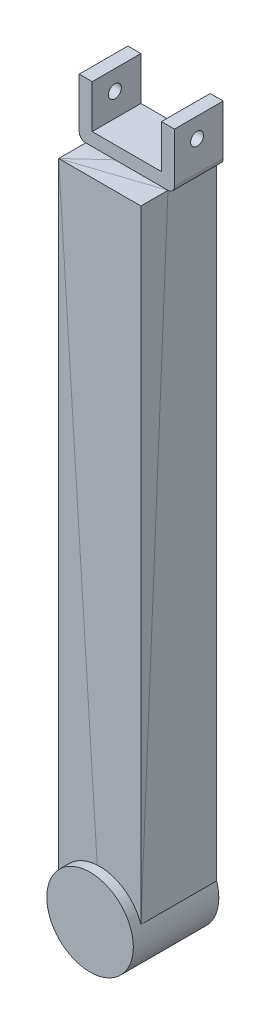
ISO-10303-21;
HEADER;
FILE_DESCRIPTION(('STEP AP214'),'2;1');
FILE_NAME('part.step','',(''),(''),'','','');
FILE_SCHEMA(('AUTOMOTIVE_DESIGN { 1 0 10303 214 1 1 1 1 }'));
ENDSEC;
DATA;
#1=APPLICATION_CONTEXT('core data for automotive mechanical design processes');
#2=APPLICATION_PROTOCOL_DEFINITION('international standard','automotive_design',2000,#1);
#3=PRODUCT_CONTEXT('',#1,'mechanical');
#4=PRODUCT('Part','Part','',(#3));
#5=PRODUCT_RELATED_PRODUCT_CATEGORY('part','',(#4));
#6=PRODUCT_DEFINITION_FORMATION('','',#4);
#7=PRODUCT_DEFINITION_CONTEXT('part definition',#1,'design');
#8=PRODUCT_DEFINITION('design','',#6,#7);
#9=PRODUCT_DEFINITION_SHAPE('','',#8);
#10=(LENGTH_UNIT() NAMED_UNIT(*) SI_UNIT(.MILLI.,.METRE.));
#11=(NAMED_UNIT(*) PLANE_ANGLE_UNIT() SI_UNIT($,.RADIAN.));
#12=(NAMED_UNIT(*) SI_UNIT($,.STERADIAN.) SOLID_ANGLE_UNIT());
#13=UNCERTAINTY_MEASURE_WITH_UNIT(LENGTH_MEASURE(1.E-05),#10,'distance_accuracy_value','');
#14=(GEOMETRIC_REPRESENTATION_CONTEXT(3) GLOBAL_UNCERTAINTY_ASSIGNED_CONTEXT((#13)) GLOBAL_UNIT_ASSIGNED_CONTEXT((#10,
#11,#12)) REPRESENTATION_CONTEXT('',''));
#15=CARTESIAN_POINT('',(0.,0.,0.));
#16=DIRECTION('',(0.,0.,1.));
#17=DIRECTION('',(1.,0.,0.));
#18=AXIS2_PLACEMENT_3D('',#15,#16,#17);
#19=CARTESIAN_POINT('',(-16.,6.,5.));
#20=DIRECTION('',(-1.,0.,0.));
#21=DIRECTION('',(0.,0.,1.));
#22=AXIS2_PLACEMENT_3D('',#19,#20,#21);
#23=PLANE('',#22);
#24=DIRECTION('',(0.,0.,-1.));
#25=VECTOR('',#24,1.);
#26=CARTESIAN_POINT('',(-16.,6.,5.));
#27=LINE('',#26,#25);
#28=CARTESIAN_POINT('',(-16.,6.,5.));
#29=VERTEX_POINT('',#28);
#30=CARTESIAN_POINT('',(-16.,6.,-17.5));
#31=VERTEX_POINT('',#30);
#32=EDGE_CURVE('E54',#29,#31,#27,.T.);
#33=ORIENTED_EDGE('',*,*,#32,.T.);
#34=DIRECTION('',(0.,1.,0.));
#35=VECTOR('',#34,1.);
#36=CARTESIAN_POINT('',(-16.,6.,-17.5));
#37=LINE('',#36,#35);
#38=CARTESIAN_POINT('',(-16.,26.,-17.5));
#39=VERTEX_POINT('',#38);
#40=EDGE_CURVE('E180',#31,#39,#37,.T.);
#41=ORIENTED_EDGE('',*,*,#40,.T.);
#42=DIRECTION('',(0.,0.,-1.));
#43=VECTOR('',#42,1.);
#44=CARTESIAN_POINT('',(-16.,26.,5.));
#45=LINE('',#44,#43);
#46=CARTESIAN_POINT('',(-16.,26.,5.));
#47=VERTEX_POINT('',#46);
#48=EDGE_CURVE('E237',#47,#39,#45,.T.);
#49=ORIENTED_EDGE('',*,*,#48,.F.);
#50=DIRECTION('',(0.,1.,0.));
#51=VECTOR('',#50,1.);
#52=CARTESIAN_POINT('',(-16.,6.,5.));
#53=LINE('',#52,#51);
#54=EDGE_CURVE('E204',#29,#47,#53,.T.);
#55=ORIENTED_EDGE('',*,*,#54,.F.);
#56=EDGE_LOOP('',(#33,#41,#49,#55));
#57=FACE_BOUND('',#56,.T.);
#58=CARTESIAN_POINT('',(-16.,16.8963252301986,-5.46063236981809));
#59=DIRECTION('',(-1.,0.,0.));
#60=DIRECTION('',(0.,0.,1.));
#61=AXIS2_PLACEMENT_3D('',#58,#59,#60);
#62=CIRCLE('',#61,3.);
#63=CARTESIAN_POINT('',(-16.,16.8963252301986,-2.46063236981809));
#64=VERTEX_POINT('',#63);
#65=EDGE_CURVE('E160',#64,#64,#62,.T.);
#66=ORIENTED_EDGE('',*,*,#65,.T.);
#67=EDGE_LOOP('',(#66));
#68=FACE_BOUND('',#67,.T.);
#69=ADVANCED_FACE('F46',(#57,#68),#23,.F.);
#70=CARTESIAN_POINT('',(-22.,3.00000000000002,5.));
#71=DIRECTION('',(1.,0.,0.));
#72=DIRECTION('',(0.,0.,-1.));
#73=AXIS2_PLACEMENT_3D('',#70,#71,#72);
#74=PLANE('',#73);
#75=DIRECTION('',(0.,0.,-1.));
#76=VECTOR('',#75,1.);
#77=CARTESIAN_POINT('',(-22.,26.,5.));
#78=LINE('',#77,#76);
#79=CARTESIAN_POINT('',(-22.,26.,5.));
#80=VERTEX_POINT('',#79);
#81=CARTESIAN_POINT('',(-22.,26.,-17.5));
#82=VERTEX_POINT('',#81);
#83=EDGE_CURVE('E235',#80,#82,#78,.T.);
#84=ORIENTED_EDGE('',*,*,#83,.T.);
#85=DIRECTION('',(0.,-1.,0.));
#86=VECTOR('',#85,1.);
#87=CARTESIAN_POINT('',(-22.,3.00000000000002,-17.5));
#88=LINE('',#87,#86);
#89=CARTESIAN_POINT('',(-22.,3.00000000000002,-17.5));
#90=VERTEX_POINT('',#89);
#91=EDGE_CURVE('E186',#82,#90,#88,.T.);
#92=ORIENTED_EDGE('',*,*,#91,.T.);
#93=DIRECTION('',(0.,0.,-1.));
#94=VECTOR('',#93,1.);
#95=CARTESIAN_POINT('',(-22.,3.00000000000002,5.));
#96=LINE('',#95,#94);
#97=CARTESIAN_POINT('',(-22.,3.00000000000002,5.));
#98=VERTEX_POINT('',#97);
#99=EDGE_CURVE('E233',#98,#90,#96,.T.);
#100=ORIENTED_EDGE('',*,*,#99,.F.);
#101=DIRECTION('',(0.,-1.,0.));
#102=VECTOR('',#101,1.);
#103=CARTESIAN_POINT('',(-22.,3.00000000000002,5.));
#104=LINE('',#103,#102);
#105=EDGE_CURVE('E208',#80,#98,#104,.T.);
#106=ORIENTED_EDGE('',*,*,#105,.F.);
#107=EDGE_LOOP('',(#84,#92,#100,#106));
#108=FACE_BOUND('',#107,.T.);
#109=CARTESIAN_POINT('',(-22.,16.8963252301986,-5.46063236981809));
#110=DIRECTION('',(-1.,0.,0.));
#111=DIRECTION('',(0.,0.,1.));
#112=AXIS2_PLACEMENT_3D('',#109,#110,#111);
#113=CIRCLE('',#112,3.);
#114=CARTESIAN_POINT('',(-22.,16.8963252301986,-2.46063236981809));
#115=VERTEX_POINT('',#114);
#116=EDGE_CURVE('E285',#115,#115,#113,.T.);
#117=ORIENTED_EDGE('',*,*,#116,.F.);
#118=EDGE_LOOP('',(#117));
#119=FACE_BOUND('',#118,.T.);
#120=ADVANCED_FACE('F305',(#108,#119),#74,.F.);
#121=CARTESIAN_POINT('',(-16.,6.,5.));
#122=DIRECTION('',(0.,-1.,0.));
#123=DIRECTION('',(0.,0.,-1.));
#124=AXIS2_PLACEMENT_3D('',#121,#122,#123);
#125=PLANE('',#124);
#126=DIRECTION('',(0.,0.,-1.));
#127=VECTOR('',#126,1.);
#128=CARTESIAN_POINT('',(16.,6.,5.));
#129=LINE('',#128,#127);
#130=CARTESIAN_POINT('',(16.,6.,5.));
#131=VERTEX_POINT('',#130);
#132=CARTESIAN_POINT('',(16.,6.,-17.5));
#133=VERTEX_POINT('',#132);
#134=EDGE_CURVE('E220',#131,#133,#129,.T.);
#135=ORIENTED_EDGE('',*,*,#134,.T.);
#136=DIRECTION('',(-1.,0.,0.));
#137=VECTOR('',#136,1.);
#138=CARTESIAN_POINT('',(-16.,6.,-17.5));
#139=LINE('',#138,#137);
#140=EDGE_CURVE('E177',#133,#31,#139,.T.);
#141=ORIENTED_EDGE('',*,*,#140,.T.);
#142=ORIENTED_EDGE('',*,*,#32,.F.);
#143=DIRECTION('',(-1.,0.,0.));
#144=VECTOR('',#143,1.);
#145=CARTESIAN_POINT('',(-16.,6.,5.));
#146=LINE('',#145,#144);
#147=EDGE_CURVE('E202',#131,#29,#146,.T.);
#148=ORIENTED_EDGE('',*,*,#147,.F.);
#149=EDGE_LOOP('',(#135,#141,#142,#148));
#150=FACE_BOUND('',#149,.T.);
#151=ADVANCED_FACE('F48',(#150),#125,.F.);
#152=CARTESIAN_POINT('',(-16.,26.,5.));
#153=DIRECTION('',(0.,-1.,0.));
#154=DIRECTION('',(0.,0.,-1.));
#155=AXIS2_PLACEMENT_3D('',#152,#153,#154);
#156=PLANE('',#155);
#157=ORIENTED_EDGE('',*,*,#48,.T.);
#158=DIRECTION('',(-1.,0.,0.));
#159=VECTOR('',#158,1.);
#160=CARTESIAN_POINT('',(-16.,26.,-17.5));
#161=LINE('',#160,#159);
#162=EDGE_CURVE('E183',#39,#82,#161,.T.);
#163=ORIENTED_EDGE('',*,*,#162,.T.);
#164=ORIENTED_EDGE('',*,*,#83,.F.);
#165=DIRECTION('',(-1.,0.,0.));
#166=VECTOR('',#165,1.);
#167=CARTESIAN_POINT('',(-16.,26.,5.));
#168=LINE('',#167,#166);
#169=EDGE_CURVE('E206',#47,#80,#168,.T.);
#170=ORIENTED_EDGE('',*,*,#169,.F.);
#171=EDGE_LOOP('',(#157,#163,#164,#170));
#172=FACE_BOUND('',#171,.T.);
#173=ADVANCED_FACE('F312',(#172),#156,.F.);
#174=CARTESIAN_POINT('',(-19.,3.,5.));
#175=DIRECTION('',(0.,0.,-1.));
#176=DIRECTION('',(-1.,0.,0.));
#177=AXIS2_PLACEMENT_3D('',#174,#175,#176);
#178=CYLINDRICAL_SURFACE('',#177,3.);
#179=ORIENTED_EDGE('',*,*,#99,.T.);
#180=CARTESIAN_POINT('',(-19.,3.,-17.5));
#181=DIRECTION('',(0.,0.,1.));
#182=DIRECTION('',(-1.,0.,0.));
#183=AXIS2_PLACEMENT_3D('',#180,#181,#182);
#184=CIRCLE('',#183,3.);
#185=CARTESIAN_POINT('',(-19.,0.,-17.5));
#186=VERTEX_POINT('',#185);
#187=EDGE_CURVE('E189',#90,#186,#184,.T.);
#188=ORIENTED_EDGE('',*,*,#187,.T.);
#189=DIRECTION('',(0.,0.,-1.));
#190=VECTOR('',#189,1.);
#191=CARTESIAN_POINT('',(-19.,0.,5.));
#192=LINE('',#191,#190);
#193=CARTESIAN_POINT('',(-19.,0.,5.));
#194=VERTEX_POINT('',#193);
#195=EDGE_CURVE('E230',#194,#186,#192,.T.);
#196=ORIENTED_EDGE('',*,*,#195,.F.);
#197=CARTESIAN_POINT('',(-19.,3.,5.));
#198=DIRECTION('',(0.,0.,1.));
#199=DIRECTION('',(-1.,0.,0.));
#200=AXIS2_PLACEMENT_3D('',#197,#198,#199);
#201=CIRCLE('',#200,3.);
#202=EDGE_CURVE('E210',#98,#194,#201,.T.);
#203=ORIENTED_EDGE('',*,*,#202,.F.);
#204=EDGE_LOOP('',(#179,#188,#196,#203));
#205=FACE_BOUND('',#204,.T.);
#206=ADVANCED_FACE('F314',(#205),#178,.T.);
#207=CARTESIAN_POINT('',(19.,3.,5.));
#208=DIRECTION('',(0.,0.,-1.));
#209=DIRECTION('',(-1.,0.,0.));
#210=AXIS2_PLACEMENT_3D('',#207,#208,#209);
#211=CYLINDRICAL_SURFACE('',#210,3.);
#212=DIRECTION('',(0.,0.,-1.));
#213=VECTOR('',#212,1.);
#214=CARTESIAN_POINT('',(19.,0.,5.));
#215=LINE('',#214,#213);
#216=CARTESIAN_POINT('',(19.,0.,5.));
#217=VERTEX_POINT('',#216);
#218=CARTESIAN_POINT('',(19.,0.,-17.5));
#219=VERTEX_POINT('',#218);
#220=EDGE_CURVE('E228',#217,#219,#215,.T.);
#221=ORIENTED_EDGE('',*,*,#220,.T.);
#222=CARTESIAN_POINT('',(19.,3.,-17.5));
#223=DIRECTION('',(0.,0.,1.));
#224=DIRECTION('',(1.,0.,0.));
#225=AXIS2_PLACEMENT_3D('',#222,#223,#224);
#226=CIRCLE('',#225,3.);
#227=CARTESIAN_POINT('',(22.,3.00000000000002,-17.5));
#228=VERTEX_POINT('',#227);
#229=EDGE_CURVE('E165',#219,#228,#226,.T.);
#230=ORIENTED_EDGE('',*,*,#229,.T.);
#231=DIRECTION('',(0.,0.,-1.));
#232=VECTOR('',#231,1.);
#233=CARTESIAN_POINT('',(22.,3.00000000000002,5.));
#234=LINE('',#233,#232);
#235=CARTESIAN_POINT('',(22.,3.00000000000002,5.));
#236=VERTEX_POINT('',#235);
#237=EDGE_CURVE('E226',#236,#228,#234,.T.);
#238=ORIENTED_EDGE('',*,*,#237,.F.);
#239=CARTESIAN_POINT('',(19.,3.,5.));
#240=DIRECTION('',(0.,0.,1.));
#241=DIRECTION('',(1.,0.,0.));
#242=AXIS2_PLACEMENT_3D('',#239,#240,#241);
#243=CIRCLE('',#242,3.);
#244=EDGE_CURVE('E214',#217,#236,#243,.T.);
#245=ORIENTED_EDGE('',*,*,#244,.F.);
#246=EDGE_LOOP('',(#221,#230,#238,#245));
#247=FACE_BOUND('',#246,.T.);
#248=ADVANCED_FACE('F260',(#247),#211,.T.);
#249=CARTESIAN_POINT('',(22.,3.00000000000002,5.));
#250=DIRECTION('',(-1.,0.,0.));
#251=DIRECTION('',(0.,0.,1.));
#252=AXIS2_PLACEMENT_3D('',#249,#250,#251);
#253=PLANE('',#252);
#254=CARTESIAN_POINT('',(22.,16.8963252301986,-5.46063236981809));
#255=DIRECTION('',(-1.,0.,0.));
#256=DIRECTION('',(0.,0.,1.));
#257=AXIS2_PLACEMENT_3D('',#254,#255,#256);
#258=CIRCLE('',#257,3.);
#259=CARTESIAN_POINT('',(22.,16.8963252301986,-2.46063236981809));
#260=VERTEX_POINT('',#259);
#261=EDGE_CURVE('E269',#260,#260,#258,.T.);
#262=ORIENTED_EDGE('',*,*,#261,.T.);
#263=EDGE_LOOP('',(#262));
#264=FACE_BOUND('',#263,.T.);
#265=ORIENTED_EDGE('',*,*,#237,.T.);
#266=DIRECTION('',(0.,1.,0.));
#267=VECTOR('',#266,1.);
#268=CARTESIAN_POINT('',(22.,3.00000000000002,-17.5));
#269=LINE('',#268,#267);
#270=CARTESIAN_POINT('',(22.,26.,-17.5));
#271=VERTEX_POINT('',#270);
#272=EDGE_CURVE('E193',#228,#271,#269,.T.);
#273=ORIENTED_EDGE('',*,*,#272,.T.);
#274=DIRECTION('',(0.,0.,-1.));
#275=VECTOR('',#274,1.);
#276=CARTESIAN_POINT('',(22.,26.,5.));
#277=LINE('',#276,#275);
#278=CARTESIAN_POINT('',(22.,26.,5.));
#279=VERTEX_POINT('',#278);
#280=EDGE_CURVE('E224',#279,#271,#277,.T.);
#281=ORIENTED_EDGE('',*,*,#280,.F.);
#282=DIRECTION('',(0.,1.,0.));
#283=VECTOR('',#282,1.);
#284=CARTESIAN_POINT('',(22.,3.00000000000002,5.));
#285=LINE('',#284,#283);
#286=EDGE_CURVE('E216',#236,#279,#285,.T.);
#287=ORIENTED_EDGE('',*,*,#286,.F.);
#288=EDGE_LOOP('',(#265,#273,#281,#287));
#289=FACE_BOUND('',#288,.T.);
#290=ADVANCED_FACE('F255',(#264,#289),#253,.F.);
#291=CARTESIAN_POINT('',(16.,26.,5.));
#292=DIRECTION('',(0.,-1.,0.));
#293=DIRECTION('',(0.,0.,-1.));
#294=AXIS2_PLACEMENT_3D('',#291,#292,#293);
#295=PLANE('',#294);
#296=ORIENTED_EDGE('',*,*,#280,.T.);
#297=DIRECTION('',(-1.,0.,0.));
#298=VECTOR('',#297,1.);
#299=CARTESIAN_POINT('',(16.,26.,-17.5));
#300=LINE('',#299,#298);
#301=CARTESIAN_POINT('',(16.,26.,-17.5));
#302=VERTEX_POINT('',#301);
#303=EDGE_CURVE('E196',#271,#302,#300,.T.);
#304=ORIENTED_EDGE('',*,*,#303,.T.);
#305=DIRECTION('',(0.,0.,-1.));
#306=VECTOR('',#305,1.);
#307=CARTESIAN_POINT('',(16.,26.,5.));
#308=LINE('',#307,#306);
#309=CARTESIAN_POINT('',(16.,26.,5.));
#310=VERTEX_POINT('',#309);
#311=EDGE_CURVE('E222',#310,#302,#308,.T.);
#312=ORIENTED_EDGE('',*,*,#311,.F.);
#313=DIRECTION('',(-1.,0.,0.));
#314=VECTOR('',#313,1.);
#315=CARTESIAN_POINT('',(16.,26.,5.));
#316=LINE('',#315,#314);
#317=EDGE_CURVE('E66',#279,#310,#316,.T.);
#318=ORIENTED_EDGE('',*,*,#317,.F.);
#319=EDGE_LOOP('',(#296,#304,#312,#318));
#320=FACE_BOUND('',#319,.T.);
#321=ADVANCED_FACE('F324',(#320),#295,.F.);
#322=CARTESIAN_POINT('',(16.,6.,5.));
#323=DIRECTION('',(1.,0.,0.));
#324=DIRECTION('',(0.,1.,0.));
#325=AXIS2_PLACEMENT_3D('',#322,#323,#324);
#326=PLANE('',#325);
#327=CARTESIAN_POINT('',(16.,16.8963252301986,-5.46063236981809));
#328=DIRECTION('',(-1.,0.,0.));
#329=DIRECTION('',(0.,0.,1.));
#330=AXIS2_PLACEMENT_3D('',#327,#328,#329);
#331=CIRCLE('',#330,3.);
#332=CARTESIAN_POINT('',(16.,16.8963252301986,-2.46063236981809));
#333=VERTEX_POINT('',#332);
#334=EDGE_CURVE('E273',#333,#333,#331,.T.);
#335=ORIENTED_EDGE('',*,*,#334,.F.);
#336=EDGE_LOOP('',(#335));
#337=FACE_BOUND('',#336,.T.);
#338=ORIENTED_EDGE('',*,*,#311,.T.);
#339=DIRECTION('',(0.,-1.,0.));
#340=VECTOR('',#339,1.);
#341=CARTESIAN_POINT('',(16.,6.,-17.5));
#342=LINE('',#341,#340);
#343=EDGE_CURVE('E199',#302,#133,#342,.T.);
#344=ORIENTED_EDGE('',*,*,#343,.T.);
#345=ORIENTED_EDGE('',*,*,#134,.F.);
#346=DIRECTION('',(0.,-1.,0.));
#347=VECTOR('',#346,1.);
#348=CARTESIAN_POINT('',(16.,6.,5.));
#349=LINE('',#348,#347);
#350=EDGE_CURVE('E61',#310,#131,#349,.T.);
#351=ORIENTED_EDGE('',*,*,#350,.F.);
#352=EDGE_LOOP('',(#338,#344,#345,#351));
#353=FACE_BOUND('',#352,.T.);
#354=ADVANCED_FACE('F250',(#337,#353),#326,.F.);
#355=CARTESIAN_POINT('',(19.,3.,5.));
#356=DIRECTION('',(0.,0.,1.));
#357=DIRECTION('',(1.,0.,0.));
#358=AXIS2_PLACEMENT_3D('',#355,#356,#357);
#359=PLANE('',#358);
#360=ORIENTED_EDGE('',*,*,#147,.T.);
#361=ORIENTED_EDGE('',*,*,#54,.T.);
#362=ORIENTED_EDGE('',*,*,#169,.T.);
#363=ORIENTED_EDGE('',*,*,#105,.T.);
#364=ORIENTED_EDGE('',*,*,#202,.T.);
#365=DIRECTION('',(1.,0.,0.));
#366=VECTOR('',#365,1.);
#367=CARTESIAN_POINT('',(-19.,0.,5.));
#368=LINE('',#367,#366);
#369=EDGE_CURVE('E212',#194,#217,#368,.T.);
#370=ORIENTED_EDGE('',*,*,#369,.T.);
#371=ORIENTED_EDGE('',*,*,#244,.T.);
#372=ORIENTED_EDGE('',*,*,#286,.T.);
#373=ORIENTED_EDGE('',*,*,#317,.T.);
#374=ORIENTED_EDGE('',*,*,#350,.T.);
#375=EDGE_LOOP('',(#360,#361,#362,#363,#364,#370,#371,#372,#373,#374));
#376=FACE_BOUND('',#375,.T.);
#377=ADVANCED_FACE('F330',(#376),#359,.T.);
#378=CARTESIAN_POINT('',(19.,3.,-17.5));
#379=DIRECTION('',(0.,0.,1.));
#380=DIRECTION('',(1.,0.,0.));
#381=AXIS2_PLACEMENT_3D('',#378,#379,#380);
#382=PLANE('',#381);
#383=DIRECTION('',(0.,1.,0.));
#384=VECTOR('',#383,1.);
#385=CARTESIAN_POINT('',(19.,-295.,-17.5));
#386=LINE('',#385,#384);
#387=CARTESIAN_POINT('',(19.,-287.538944796277,-17.5));
#388=VERTEX_POINT('',#387);
#389=EDGE_CURVE('E156',#388,#219,#386,.T.);
#390=ORIENTED_EDGE('',*,*,#389,.F.);
#391=CARTESIAN_POINT('',(0.,-293.783942794676,-17.5));
#392=DIRECTION('',(0.,0.,1.));
#393=DIRECTION('',(1.,0.,0.));
#394=AXIS2_PLACEMENT_3D('',#391,#392,#393);
#395=CIRCLE('',#394,20.);
#396=CARTESIAN_POINT('',(-19.,-287.538944796277,-17.5));
#397=VERTEX_POINT('',#396);
#398=EDGE_CURVE('E139',#397,#388,#395,.T.);
#399=ORIENTED_EDGE('',*,*,#398,.F.);
#400=DIRECTION('',(0.,1.,0.));
#401=VECTOR('',#400,1.);
#402=CARTESIAN_POINT('',(-19.,-295.,-17.5));
#403=LINE('',#402,#401);
#404=EDGE_CURVE('E167',#397,#186,#403,.T.);
#405=ORIENTED_EDGE('',*,*,#404,.T.);
#406=ORIENTED_EDGE('',*,*,#187,.F.);
#407=ORIENTED_EDGE('',*,*,#91,.F.);
#408=ORIENTED_EDGE('',*,*,#162,.F.);
#409=ORIENTED_EDGE('',*,*,#40,.F.);
#410=ORIENTED_EDGE('',*,*,#140,.F.);
#411=ORIENTED_EDGE('',*,*,#343,.F.);
#412=ORIENTED_EDGE('',*,*,#303,.F.);
#413=ORIENTED_EDGE('',*,*,#272,.F.);
#414=ORIENTED_EDGE('',*,*,#229,.F.);
#415=EDGE_LOOP('',(#390,#399,#405,#406,#407,#408,#409,#410,#411,#412,#413,#414));
#416=FACE_BOUND('',#415,.T.);
#417=ADVANCED_FACE('F162',(#416),#382,.F.);
#418=CARTESIAN_POINT('',(19.,-295.,-17.5));
#419=DIRECTION('',(1.,0.,0.));
#420=DIRECTION('',(0.,0.,-1.));
#421=AXIS2_PLACEMENT_3D('',#418,#419,#420);
#422=PLANE('',#421);
#423=DIRECTION('',(0.,0.,1.));
#424=VECTOR('',#423,1.);
#425=CARTESIAN_POINT('',(19.,-287.538944796277,-17.5));
#426=LINE('',#425,#424);
#427=CARTESIAN_POINT('',(19.0000000000001,-287.538944796277,17.5));
#428=VERTEX_POINT('',#427);
#429=EDGE_CURVE('E143',#388,#428,#426,.T.);
#430=ORIENTED_EDGE('',*,*,#429,.F.);
#431=ORIENTED_EDGE('',*,*,#389,.T.);
#432=ORIENTED_EDGE('',*,*,#220,.F.);
#433=DIRECTION('',(0.,0.,-1.));
#434=VECTOR('',#433,1.);
#435=CARTESIAN_POINT('',(19.,0.,-17.5));
#436=LINE('',#435,#434);
#437=CARTESIAN_POINT('',(19.0000000000001,0.,17.5));
#438=VERTEX_POINT('',#437);
#439=EDGE_CURVE('E262',#438,#217,#436,.T.);
#440=ORIENTED_EDGE('',*,*,#439,.F.);
#441=DIRECTION('',(0.,1.,0.));
#442=VECTOR('',#441,1.);
#443=CARTESIAN_POINT('',(19.0000000000001,-295.,17.5));
#444=LINE('',#443,#442);
#445=EDGE_CURVE('E159',#428,#438,#444,.T.);
#446=ORIENTED_EDGE('',*,*,#445,.F.);
#447=EDGE_LOOP('',(#430,#431,#432,#440,#446));
#448=FACE_BOUND('',#447,.T.);
#449=ADVANCED_FACE('F154',(#448),#422,.T.);
#450=CARTESIAN_POINT('',(-18.9999999999999,-295.,17.5));
#451=DIRECTION('',(0.,0.,1.));
#452=DIRECTION('',(1.,0.,0.));
#453=AXIS2_PLACEMENT_3D('',#450,#451,#452);
#454=PLANE('',#453);
#455=CARTESIAN_POINT('',(0.,-293.783942794676,17.5));
#456=DIRECTION('',(0.,0.,1.));
#457=DIRECTION('',(1.,0.,0.));
#458=AXIS2_PLACEMENT_3D('',#455,#456,#457);
#459=CIRCLE('',#458,20.);
#460=CARTESIAN_POINT('',(-19.,-287.538944796277,17.5));
#461=VERTEX_POINT('',#460);
#462=EDGE_CURVE('E149',#428,#461,#459,.T.);
#463=ORIENTED_EDGE('',*,*,#462,.F.);
#464=ORIENTED_EDGE('',*,*,#445,.T.);
#465=DIRECTION('',(1.,0.,0.));
#466=VECTOR('',#465,1.);
#467=CARTESIAN_POINT('',(-18.9999999999999,0.,17.5));
#468=LINE('',#467,#466);
#469=CARTESIAN_POINT('',(-18.9999999999999,0.,17.5));
#470=VERTEX_POINT('',#469);
#471=EDGE_CURVE('E168',#470,#438,#468,.T.);
#472=ORIENTED_EDGE('',*,*,#471,.F.);
#473=DIRECTION('',(0.,1.,0.));
#474=VECTOR('',#473,1.);
#475=CARTESIAN_POINT('',(-18.9999999999999,-295.,17.5));
#476=LINE('',#475,#474);
#477=EDGE_CURVE('E170',#461,#470,#476,.T.);
#478=ORIENTED_EDGE('',*,*,#477,.F.);
#479=EDGE_LOOP('',(#463,#464,#472,#478));
#480=FACE_BOUND('',#479,.T.);
#481=ADVANCED_FACE('F281',(#480),#454,.T.);
#482=CARTESIAN_POINT('',(-19.,-295.,-17.5));
#483=DIRECTION('',(-1.,0.,0.));
#484=DIRECTION('',(0.,0.,1.));
#485=AXIS2_PLACEMENT_3D('',#482,#483,#484);
#486=PLANE('',#485);
#487=CARTESIAN_POINT('',(-19.,-85.,0.));
#488=DIRECTION('',(-1.,0.,0.));
#489=DIRECTION('',(0.,0.,1.));
#490=AXIS2_PLACEMENT_3D('',#487,#488,#489);
#491=CIRCLE('',#490,5.);
#492=CARTESIAN_POINT('',(-19.,-85.,5.00000000000001));
#493=VERTEX_POINT('',#492);
#494=EDGE_CURVE('E437',#493,#493,#491,.T.);
#495=ORIENTED_EDGE('',*,*,#494,.F.);
#496=EDGE_LOOP('',(#495));
#497=FACE_BOUND('',#496,.T.);
#498=DIRECTION('',(0.,0.,1.));
#499=VECTOR('',#498,1.);
#500=CARTESIAN_POINT('',(-19.,-287.538944796277,-17.5));
#501=LINE('',#500,#499);
#502=EDGE_CURVE('E12',#461,#397,#501,.F.);
#503=ORIENTED_EDGE('',*,*,#502,.F.);
#504=ORIENTED_EDGE('',*,*,#477,.T.);
#505=DIRECTION('',(0.,0.,1.));
#506=VECTOR('',#505,1.);
#507=CARTESIAN_POINT('',(-19.,0.,-17.5));
#508=LINE('',#507,#506);
#509=EDGE_CURVE('E173',#194,#470,#508,.T.);
#510=ORIENTED_EDGE('',*,*,#509,.F.);
#511=ORIENTED_EDGE('',*,*,#195,.T.);
#512=ORIENTED_EDGE('',*,*,#404,.F.);
#513=EDGE_LOOP('',(#503,#504,#510,#511,#512));
#514=FACE_BOUND('',#513,.T.);
#515=ADVANCED_FACE('F279',(#497,#514),#486,.T.);
#516=CARTESIAN_POINT('',(0.,0.,0.));
#517=DIRECTION('',(0.,1.,0.));
#518=DIRECTION('',(0.,0.,1.));
#519=AXIS2_PLACEMENT_3D('',#516,#517,#518);
#520=PLANE('',#519);
#521=ORIENTED_EDGE('',*,*,#439,.T.);
#522=ORIENTED_EDGE('',*,*,#369,.F.);
#523=ORIENTED_EDGE('',*,*,#509,.T.);
#524=ORIENTED_EDGE('',*,*,#471,.T.);
#525=EDGE_LOOP('',(#521,#522,#523,#524));
#526=FACE_BOUND('',#525,.T.);
#527=ADVANCED_FACE('F265',(#526),#520,.T.);
#528=CARTESIAN_POINT('',(22.,16.8963252301986,-5.46063236981809));
#529=DIRECTION('',(-1.,0.,0.));
#530=DIRECTION('',(0.,0.,1.));
#531=AXIS2_PLACEMENT_3D('',#528,#529,#530);
#532=CYLINDRICAL_SURFACE('',#531,3.);
#533=ORIENTED_EDGE('',*,*,#261,.F.);
#534=EDGE_LOOP('',(#533));
#535=FACE_BOUND('',#534,.T.);
#536=ORIENTED_EDGE('',*,*,#334,.T.);
#537=EDGE_LOOP('',(#536));
#538=FACE_BOUND('',#537,.T.);
#539=ADVANCED_FACE('F293',(#535,#538),#532,.F.);
#540=CARTESIAN_POINT('',(-22.,16.8963252301986,-5.46063236981809));
#541=DIRECTION('',(1.,0.,0.));
#542=DIRECTION('',(0.,0.,-1.));
#543=AXIS2_PLACEMENT_3D('',#540,#541,#542);
#544=CYLINDRICAL_SURFACE('',#543,3.);
#545=ORIENTED_EDGE('',*,*,#116,.T.);
#546=EDGE_LOOP('',(#545));
#547=FACE_BOUND('',#546,.T.);
#548=ORIENTED_EDGE('',*,*,#65,.F.);
#549=EDGE_LOOP('',(#548));
#550=FACE_BOUND('',#549,.T.);
#551=ADVANCED_FACE('F291',(#547,#550),#544,.F.);
#552=CARTESIAN_POINT('',(0.,-293.783942794676,-17.5));
#553=DIRECTION('',(0.,0.,1.));
#554=DIRECTION('',(1.,0.,0.));
#555=AXIS2_PLACEMENT_3D('',#552,#553,#554);
#556=CYLINDRICAL_SURFACE('',#555,20.);
#557=ORIENTED_EDGE('',*,*,#398,.T.);
#558=ORIENTED_EDGE('',*,*,#429,.T.);
#559=ORIENTED_EDGE('',*,*,#462,.T.);
#560=ORIENTED_EDGE('',*,*,#502,.T.);
#561=EDGE_LOOP('',(#557,#558,#559,#560));
#562=FACE_BOUND('',#561,.T.);
#563=CARTESIAN_POINT('',(0.,-293.783942794676,22.));
#564=DIRECTION('',(0.,0.,1.));
#565=DIRECTION('',(1.,0.,0.));
#566=AXIS2_PLACEMENT_3D('',#563,#564,#565);
#567=CIRCLE('',#566,20.);
#568=CARTESIAN_POINT('',(20.,-293.783942794676,22.));
#569=VERTEX_POINT('',#568);
#570=EDGE_CURVE('E150',#569,#569,#567,.T.);
#571=ORIENTED_EDGE('',*,*,#570,.F.);
#572=EDGE_LOOP('',(#571));
#573=FACE_BOUND('',#572,.T.);
#574=ADVANCED_FACE('F141',(#562,#573),#556,.T.);
#575=CARTESIAN_POINT('',(0.,-293.783942794676,22.));
#576=DIRECTION('',(0.,0.,1.));
#577=DIRECTION('',(1.,0.,0.));
#578=AXIS2_PLACEMENT_3D('',#575,#576,#577);
#579=PLANE('',#578);
#580=ORIENTED_EDGE('',*,*,#570,.T.);
#581=EDGE_LOOP('',(#580));
#582=FACE_BOUND('',#581,.T.);
#583=ADVANCED_FACE('F300',(#582),#579,.T.);
#584=CARTESIAN_POINT('',(-8.99999999999995,-85.,0.));
#585=DIRECTION('',(-1.,0.,0.));
#586=DIRECTION('',(0.,0.,1.));
#587=AXIS2_PLACEMENT_3D('',#584,#585,#586);
#588=CYLINDRICAL_SURFACE('',#587,5.);
#589=CARTESIAN_POINT('',(-8.99999999999995,-85.,0.));
#590=DIRECTION('',(-1.,0.,0.));
#591=DIRECTION('',(0.,0.,1.));
#592=AXIS2_PLACEMENT_3D('',#589,#590,#591);
#593=CIRCLE('',#592,5.);
#594=CARTESIAN_POINT('',(-8.99999999999995,-85.,5.00000000000001));
#595=VERTEX_POINT('',#594);
#596=EDGE_CURVE('E436',#595,#595,#593,.T.);
#597=ORIENTED_EDGE('',*,*,#596,.F.);
#598=EDGE_LOOP('',(#597));
#599=FACE_BOUND('',#598,.T.);
#600=ORIENTED_EDGE('',*,*,#494,.T.);
#601=EDGE_LOOP('',(#600));
#602=FACE_BOUND('',#601,.T.);
#603=ADVANCED_FACE('F406',(#599,#602),#588,.F.);
#604=CARTESIAN_POINT('',(-8.99999999999995,-85.,0.));
#605=DIRECTION('',(-1.,0.,0.));
#606=DIRECTION('',(0.,0.,1.));
#607=AXIS2_PLACEMENT_3D('',#604,#605,#606);
#608=PLANE('',#607);
#609=ORIENTED_EDGE('',*,*,#596,.T.);
#610=EDGE_LOOP('',(#609));
#611=FACE_BOUND('',#610,.T.);
#612=ADVANCED_FACE('F420',(#611),#608,.T.);
#613=CLOSED_SHELL('',(#69,#120,#151,#173,#206,#248,#290,#321,#354,#377,#417,#449,#481,#515,#527,
#539,#551,#574,#583,#603,#612));
#614=MANIFOLD_SOLID_BREP('B2',#613);
#615=CARTESIAN_POINT('',(19.,-295.,-17.5));
#616=DIRECTION('',(1.,0.,0.));
#617=DIRECTION('',(0.,0.,-1.));
#618=AXIS2_PLACEMENT_3D('',#615,#616,#617);
#619=PLANE('',#618);
#620=DIRECTION('',(0.,0.,-1.));
#621=VECTOR('',#620,1.);
#622=CARTESIAN_POINT('',(19.,0.,-17.5));
#623=LINE('',#622,#621);
#624=CARTESIAN_POINT('',(19.0000000000001,0.,17.5));
#625=VERTEX_POINT('',#624);
#626=CARTESIAN_POINT('',(19.,0.,-17.5));
#627=VERTEX_POINT('',#626);
#628=EDGE_CURVE('E574',#625,#627,#623,.T.);
#629=ORIENTED_EDGE('',*,*,#628,.F.);
#630=DIRECTION('',(0.,1.,0.));
#631=VECTOR('',#630,1.);
#632=CARTESIAN_POINT('',(19.0000000000001,-295.,17.5));
#633=LINE('',#632,#631);
#634=CARTESIAN_POINT('',(19.0000000000001,-295.,17.5));
#635=VERTEX_POINT('',#634);
#636=EDGE_CURVE('E44',#635,#625,#633,.T.);
#637=ORIENTED_EDGE('',*,*,#636,.F.);
#638=DIRECTION('',(0.,0.,-1.));
#639=VECTOR('',#638,1.);
#640=CARTESIAN_POINT('',(19.,-295.,-17.5));
#641=LINE('',#640,#639);
#642=CARTESIAN_POINT('',(19.,-295.,-17.5));
#643=VERTEX_POINT('',#642);
#644=EDGE_CURVE('E568',#635,#643,#641,.T.);
#645=ORIENTED_EDGE('',*,*,#644,.T.);
#646=DIRECTION('',(0.,1.,0.));
#647=VECTOR('',#646,1.);
#648=CARTESIAN_POINT('',(19.,-295.,-17.5));
#649=LINE('',#648,#647);
#650=EDGE_CURVE('E513',#643,#627,#649,.T.);
#651=ORIENTED_EDGE('',*,*,#650,.T.);
#652=EDGE_LOOP('',(#629,#637,#645,#651));
#653=FACE_BOUND('',#652,.T.);
#654=ADVANCED_FACE('F510',(#653),#619,.T.);
#655=CARTESIAN_POINT('',(-18.9999999999999,-295.,17.5));
#656=DIRECTION('',(0.,0.,1.));
#657=DIRECTION('',(1.,0.,0.));
#658=AXIS2_PLACEMENT_3D('',#655,#656,#657);
#659=PLANE('',#658);
#660=DIRECTION('',(1.,0.,0.));
#661=VECTOR('',#660,1.);
#662=CARTESIAN_POINT('',(-18.9999999999999,0.,17.5));
#663=LINE('',#662,#661);
#664=CARTESIAN_POINT('',(-18.9999999999999,0.,17.5));
#665=VERTEX_POINT('',#664);
#666=EDGE_CURVE('E570',#665,#625,#663,.T.);
#667=ORIENTED_EDGE('',*,*,#666,.F.);
#668=DIRECTION('',(0.,1.,0.));
#669=VECTOR('',#668,1.);
#670=CARTESIAN_POINT('',(-18.9999999999999,-295.,17.5));
#671=LINE('',#670,#669);
#672=CARTESIAN_POINT('',(-18.9999999999999,-295.,17.5));
#673=VERTEX_POINT('',#672);
#674=EDGE_CURVE('E519',#673,#665,#671,.T.);
#675=ORIENTED_EDGE('',*,*,#674,.F.);
#676=DIRECTION('',(1.,0.,0.));
#677=VECTOR('',#676,1.);
#678=CARTESIAN_POINT('',(-18.9999999999999,-295.,17.5));
#679=LINE('',#678,#677);
#680=EDGE_CURVE('E565',#673,#635,#679,.T.);
#681=ORIENTED_EDGE('',*,*,#680,.T.);
#682=ORIENTED_EDGE('',*,*,#636,.T.);
#683=EDGE_LOOP('',(#667,#675,#681,#682));
#684=FACE_BOUND('',#683,.T.);
#685=ADVANCED_FACE('F584',(#684),#659,.T.);
#686=CARTESIAN_POINT('',(-19.,-295.,-17.5));
#687=DIRECTION('',(-1.,0.,0.));
#688=DIRECTION('',(0.,0.,1.));
#689=AXIS2_PLACEMENT_3D('',#686,#687,#688);
#690=PLANE('',#689);
#691=DIRECTION('',(0.,0.,1.));
#692=VECTOR('',#691,1.);
#693=CARTESIAN_POINT('',(-19.,0.,-17.5));
#694=LINE('',#693,#692);
#695=CARTESIAN_POINT('',(-19.,0.,-17.5));
#696=VERTEX_POINT('',#695);
#697=EDGE_CURVE('E560',#696,#665,#694,.T.);
#698=ORIENTED_EDGE('',*,*,#697,.F.);
#699=DIRECTION('',(0.,1.,0.));
#700=VECTOR('',#699,1.);
#701=CARTESIAN_POINT('',(-19.,-295.,-17.5));
#702=LINE('',#701,#700);
#703=CARTESIAN_POINT('',(-19.,-295.,-17.5));
#704=VERTEX_POINT('',#703);
#705=EDGE_CURVE('E555',#704,#696,#702,.T.);
#706=ORIENTED_EDGE('',*,*,#705,.F.);
#707=DIRECTION('',(0.,0.,1.));
#708=VECTOR('',#707,1.);
#709=CARTESIAN_POINT('',(-19.,-295.,-17.5));
#710=LINE('',#709,#708);
#711=EDGE_CURVE('E558',#704,#673,#710,.T.);
#712=ORIENTED_EDGE('',*,*,#711,.T.);
#713=ORIENTED_EDGE('',*,*,#674,.T.);
#714=EDGE_LOOP('',(#698,#706,#712,#713));
#715=FACE_BOUND('',#714,.T.);
#716=ADVANCED_FACE('F557',(#715),#690,.T.);
#717=CARTESIAN_POINT('',(-19.,-295.,-17.5));
#718=DIRECTION('',(0.,0.,-1.));
#719=DIRECTION('',(-1.,0.,0.));
#720=AXIS2_PLACEMENT_3D('',#717,#718,#719);
#721=PLANE('',#720);
#722=DIRECTION('',(-1.,0.,0.));
#723=VECTOR('',#722,1.);
#724=CARTESIAN_POINT('',(-19.,0.,-17.5));
#725=LINE('',#724,#723);
#726=EDGE_CURVE('E577',#627,#696,#725,.T.);
#727=ORIENTED_EDGE('',*,*,#726,.F.);
#728=ORIENTED_EDGE('',*,*,#650,.F.);
#729=DIRECTION('',(-1.,0.,0.));
#730=VECTOR('',#729,1.);
#731=CARTESIAN_POINT('',(-19.,-295.,-17.5));
#732=LINE('',#731,#730);
#733=EDGE_CURVE('E564',#643,#704,#732,.T.);
#734=ORIENTED_EDGE('',*,*,#733,.T.);
#735=ORIENTED_EDGE('',*,*,#705,.T.);
#736=EDGE_LOOP('',(#727,#728,#734,#735));
#737=FACE_BOUND('',#736,.T.);
#738=ADVANCED_FACE('F567',(#737),#721,.T.);
#739=CARTESIAN_POINT('',(0.,-295.,0.));
#740=DIRECTION('',(0.,1.,0.));
#741=DIRECTION('',(0.,0.,1.));
#742=AXIS2_PLACEMENT_3D('',#739,#740,#741);
#743=PLANE('',#742);
#744=ORIENTED_EDGE('',*,*,#644,.F.);
#745=ORIENTED_EDGE('',*,*,#680,.F.);
#746=ORIENTED_EDGE('',*,*,#711,.F.);
#747=ORIENTED_EDGE('',*,*,#733,.F.);
#748=EDGE_LOOP('',(#744,#745,#746,#747));
#749=FACE_BOUND('',#748,.T.);
#750=ADVANCED_FACE('F563',(#749),#743,.F.);
#751=CARTESIAN_POINT('',(0.,0.,0.));
#752=DIRECTION('',(0.,1.,0.));
#753=DIRECTION('',(0.,0.,1.));
#754=AXIS2_PLACEMENT_3D('',#751,#752,#753);
#755=PLANE('',#754);
#756=ORIENTED_EDGE('',*,*,#628,.T.);
#757=ORIENTED_EDGE('',*,*,#726,.T.);
#758=ORIENTED_EDGE('',*,*,#697,.T.);
#759=ORIENTED_EDGE('',*,*,#666,.T.);
#760=EDGE_LOOP('',(#756,#757,#758,#759));
#761=FACE_BOUND('',#760,.T.);
#762=ADVANCED_FACE('F583',(#761),#755,.T.);
#763=CLOSED_SHELL('',(#654,#685,#716,#738,#750,#762));
#764=MANIFOLD_SOLID_BREP('B6_NOT_SHOWN',#763);
#765=ADVANCED_BREP_SHAPE_REPRESENTATION('',(#18,#614,#764),#14);
#766=SHAPE_DEFINITION_REPRESENTATION(#9,#765);
ENDSEC;
END-ISO-10303-21;
